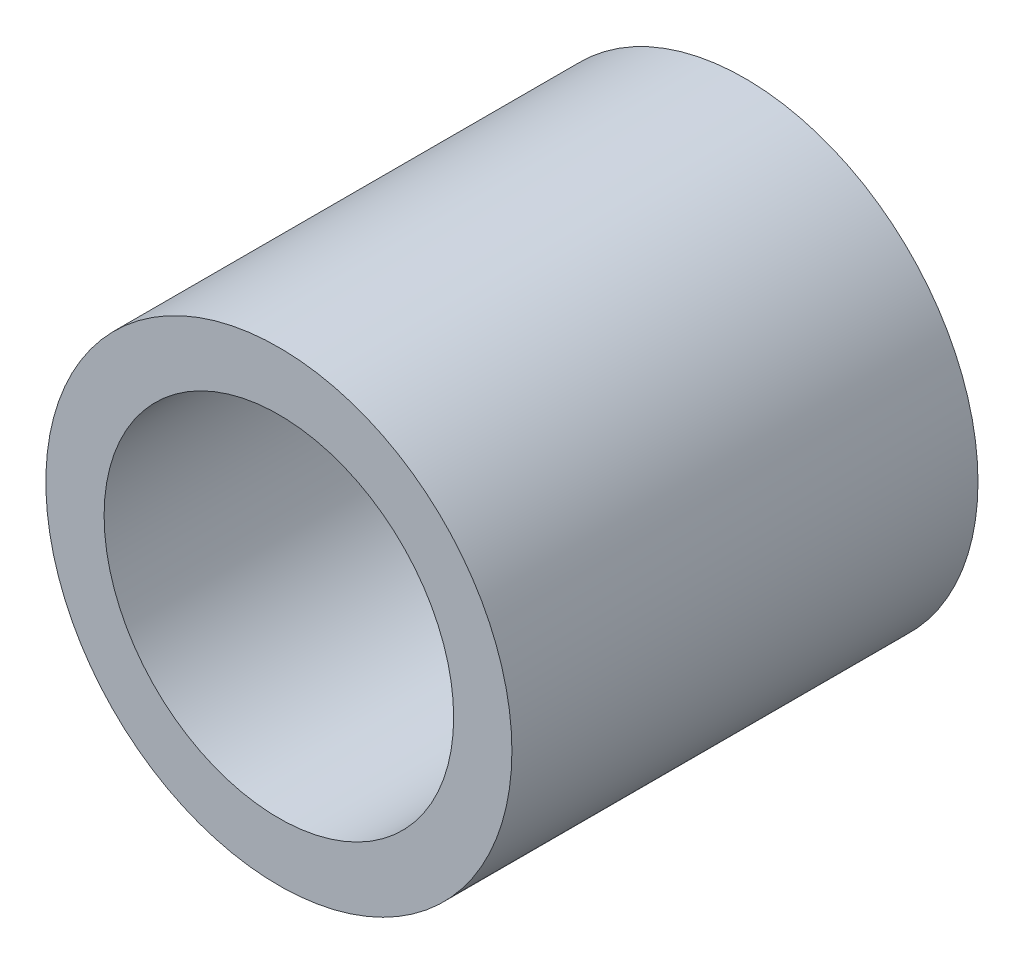
ISO-10303-21;
HEADER;
FILE_DESCRIPTION(('STEP AP214'),'2;1');
FILE_NAME('part.step','',(''),(''),'','','');
FILE_SCHEMA(('AUTOMOTIVE_DESIGN { 1 0 10303 214 1 1 1 1 }'));
ENDSEC;
DATA;
#1=APPLICATION_CONTEXT('core data for automotive mechanical design processes');
#2=APPLICATION_PROTOCOL_DEFINITION('international standard','automotive_design',2000,#1);
#3=PRODUCT_CONTEXT('',#1,'mechanical');
#4=PRODUCT('Part','Part','',(#3));
#5=PRODUCT_RELATED_PRODUCT_CATEGORY('part','',(#4));
#6=PRODUCT_DEFINITION_FORMATION('','',#4);
#7=PRODUCT_DEFINITION_CONTEXT('part definition',#1,'design');
#8=PRODUCT_DEFINITION('design','',#6,#7);
#9=PRODUCT_DEFINITION_SHAPE('','',#8);
#10=(LENGTH_UNIT() NAMED_UNIT(*) SI_UNIT(.MILLI.,.METRE.));
#11=(NAMED_UNIT(*) PLANE_ANGLE_UNIT() SI_UNIT($,.RADIAN.));
#12=(NAMED_UNIT(*) SI_UNIT($,.STERADIAN.) SOLID_ANGLE_UNIT());
#13=UNCERTAINTY_MEASURE_WITH_UNIT(LENGTH_MEASURE(1.E-05),#10,'distance_accuracy_value','');
#14=(GEOMETRIC_REPRESENTATION_CONTEXT(3) GLOBAL_UNCERTAINTY_ASSIGNED_CONTEXT((#13)) GLOBAL_UNIT_ASSIGNED_CONTEXT((#10,
#11,#12)) REPRESENTATION_CONTEXT('',''));
#15=CARTESIAN_POINT('',(0.,0.,0.));
#16=DIRECTION('',(0.,0.,1.));
#17=DIRECTION('',(1.,0.,0.));
#18=AXIS2_PLACEMENT_3D('',#15,#16,#17);
#19=CARTESIAN_POINT('',(0.,0.,12.7));
#20=DIRECTION('',(0.,0.,1.));
#21=DIRECTION('',(1.,0.,0.));
#22=AXIS2_PLACEMENT_3D('',#19,#20,#21);
#23=PLANE('',#22);
#24=CARTESIAN_POINT('',(0.,0.,12.7));
#25=DIRECTION('',(0.,0.,1.));
#26=DIRECTION('',(1.,0.,0.));
#27=AXIS2_PLACEMENT_3D('',#24,#25,#26);
#28=CIRCLE('',#27,6.35);
#29=CARTESIAN_POINT('',(6.35,0.,12.7));
#30=VERTEX_POINT('',#29);
#31=EDGE_CURVE('E10',#30,#30,#28,.T.);
#32=ORIENTED_EDGE('',*,*,#31,.T.);
#33=EDGE_LOOP('',(#32));
#34=FACE_BOUND('',#33,.T.);
#35=CARTESIAN_POINT('',(0.,0.,12.7));
#36=DIRECTION('',(0.,0.,1.));
#37=DIRECTION('',(1.,0.,0.));
#38=AXIS2_PLACEMENT_3D('',#35,#36,#37);
#39=CIRCLE('',#38,4.7625);
#40=CARTESIAN_POINT('',(4.7625,0.,12.7));
#41=VERTEX_POINT('',#40);
#42=EDGE_CURVE('E43',#41,#41,#39,.T.);
#43=ORIENTED_EDGE('',*,*,#42,.F.);
#44=EDGE_LOOP('',(#43));
#45=FACE_BOUND('',#44,.T.);
#46=ADVANCED_FACE('F32',(#34,#45),#23,.T.);
#47=CARTESIAN_POINT('',(0.,0.,0.));
#48=DIRECTION('',(0.,0.,1.));
#49=DIRECTION('',(1.,0.,0.));
#50=AXIS2_PLACEMENT_3D('',#47,#48,#49);
#51=PLANE('',#50);
#52=CARTESIAN_POINT('',(0.,0.,0.));
#53=DIRECTION('',(0.,0.,1.));
#54=DIRECTION('',(1.,0.,0.));
#55=AXIS2_PLACEMENT_3D('',#52,#53,#54);
#56=CIRCLE('',#55,6.35);
#57=CARTESIAN_POINT('',(6.35,0.,0.));
#58=VERTEX_POINT('',#57);
#59=EDGE_CURVE('E36',#58,#58,#56,.T.);
#60=ORIENTED_EDGE('',*,*,#59,.F.);
#61=EDGE_LOOP('',(#60));
#62=FACE_BOUND('',#61,.T.);
#63=CARTESIAN_POINT('',(0.,0.,0.));
#64=DIRECTION('',(0.,0.,1.));
#65=DIRECTION('',(1.,0.,0.));
#66=AXIS2_PLACEMENT_3D('',#63,#64,#65);
#67=CIRCLE('',#66,4.7625);
#68=CARTESIAN_POINT('',(4.7625,0.,0.));
#69=VERTEX_POINT('',#68);
#70=EDGE_CURVE('E45',#69,#69,#67,.T.);
#71=ORIENTED_EDGE('',*,*,#70,.T.);
#72=EDGE_LOOP('',(#71));
#73=FACE_BOUND('',#72,.T.);
#74=ADVANCED_FACE('F55',(#62,#73),#51,.F.);
#75=CARTESIAN_POINT('',(0.,0.,12.7));
#76=DIRECTION('',(0.,0.,-1.));
#77=DIRECTION('',(-1.,0.,0.));
#78=AXIS2_PLACEMENT_3D('',#75,#76,#77);
#79=CYLINDRICAL_SURFACE('',#78,6.35);
#80=ORIENTED_EDGE('',*,*,#31,.F.);
#81=EDGE_LOOP('',(#80));
#82=FACE_BOUND('',#81,.T.);
#83=ORIENTED_EDGE('',*,*,#59,.T.);
#84=EDGE_LOOP('',(#83));
#85=FACE_BOUND('',#84,.T.);
#86=ADVANCED_FACE('F34',(#82,#85),#79,.T.);
#87=CARTESIAN_POINT('',(0.,0.,12.7));
#88=DIRECTION('',(0.,0.,-1.));
#89=DIRECTION('',(-1.,0.,0.));
#90=AXIS2_PLACEMENT_3D('',#87,#88,#89);
#91=CYLINDRICAL_SURFACE('',#90,4.7625);
#92=ORIENTED_EDGE('',*,*,#42,.T.);
#93=EDGE_LOOP('',(#92));
#94=FACE_BOUND('',#93,.T.);
#95=ORIENTED_EDGE('',*,*,#70,.F.);
#96=EDGE_LOOP('',(#95));
#97=FACE_BOUND('',#96,.T.);
#98=ADVANCED_FACE('F51',(#94,#97),#91,.F.);
#99=CLOSED_SHELL('',(#46,#74,#86,#98));
#100=MANIFOLD_SOLID_BREP('B2',#99);
#101=ADVANCED_BREP_SHAPE_REPRESENTATION('',(#18,#100),#14);
#102=SHAPE_DEFINITION_REPRESENTATION(#9,#101);
ENDSEC;
END-ISO-10303-21;
